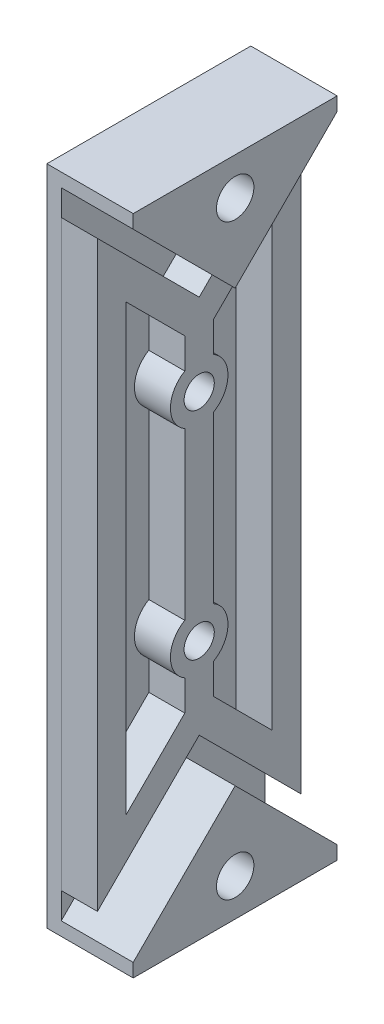
ISO-10303-21;
HEADER;
FILE_DESCRIPTION(('STEP AP214'),'2;1');
FILE_NAME('part.step','',(''),(''),'','','');
FILE_SCHEMA(('AUTOMOTIVE_DESIGN { 1 0 10303 214 1 1 1 1 }'));
ENDSEC;
DATA;
#1=APPLICATION_CONTEXT('core data for automotive mechanical design processes');
#2=APPLICATION_PROTOCOL_DEFINITION('international standard','automotive_design',2000,#1);
#3=PRODUCT_CONTEXT('',#1,'mechanical');
#4=PRODUCT('Part','Part','',(#3));
#5=PRODUCT_RELATED_PRODUCT_CATEGORY('part','',(#4));
#6=PRODUCT_DEFINITION_FORMATION('','',#4);
#7=PRODUCT_DEFINITION_CONTEXT('part definition',#1,'design');
#8=PRODUCT_DEFINITION('design','',#6,#7);
#9=PRODUCT_DEFINITION_SHAPE('','',#8);
#10=(LENGTH_UNIT() NAMED_UNIT(*) SI_UNIT(.MILLI.,.METRE.));
#11=(NAMED_UNIT(*) PLANE_ANGLE_UNIT() SI_UNIT($,.RADIAN.));
#12=(NAMED_UNIT(*) SI_UNIT($,.STERADIAN.) SOLID_ANGLE_UNIT());
#13=UNCERTAINTY_MEASURE_WITH_UNIT(LENGTH_MEASURE(1.E-05),#10,'distance_accuracy_value','');
#14=(GEOMETRIC_REPRESENTATION_CONTEXT(3) GLOBAL_UNCERTAINTY_ASSIGNED_CONTEXT((#13)) GLOBAL_UNIT_ASSIGNED_CONTEXT((#10,
#11,#12)) REPRESENTATION_CONTEXT('',''));
#15=CARTESIAN_POINT('',(0.,0.,0.));
#16=DIRECTION('',(0.,0.,1.));
#17=DIRECTION('',(1.,0.,0.));
#18=AXIS2_PLACEMENT_3D('',#15,#16,#17);
#19=CARTESIAN_POINT('',(0.,0.,-12.142135623731));
#20=DIRECTION('',(0.,0.,-1.));
#21=DIRECTION('',(-1.,0.,0.));
#22=AXIS2_PLACEMENT_3D('',#19,#20,#21);
#23=PLANE('',#22);
#24=DIRECTION('',(0.,1.,0.));
#25=VECTOR('',#24,1.);
#26=CARTESIAN_POINT('',(0.,0.,-12.142135623731));
#27=LINE('',#26,#25);
#28=CARTESIAN_POINT('',(0.,-22.0358983848622,-12.142135623731));
#29=VERTEX_POINT('',#28);
#30=CARTESIAN_POINT('',(0.,-17.7989898732233,-12.142135623731));
#31=VERTEX_POINT('',#30);
#32=EDGE_CURVE('E434',#29,#31,#27,.T.);
#33=ORIENTED_EDGE('',*,*,#32,.F.);
#34=DIRECTION('',(1.,0.,0.));
#35=VECTOR('',#34,1.);
#36=CARTESIAN_POINT('',(-2.,-22.0358983848622,-12.142135623731));
#37=LINE('',#36,#35);
#38=CARTESIAN_POINT('',(5.,-22.0358983848622,-12.142135623731));
#39=VERTEX_POINT('',#38);
#40=EDGE_CURVE('E59',#29,#39,#37,.T.);
#41=ORIENTED_EDGE('',*,*,#40,.T.);
#42=DIRECTION('',(0.,1.,0.));
#43=VECTOR('',#42,1.);
#44=CARTESIAN_POINT('',(5.,0.,-12.142135623731));
#45=LINE('',#44,#43);
#46=CARTESIAN_POINT('',(5.,-17.7989898732233,-12.142135623731));
#47=VERTEX_POINT('',#46);
#48=EDGE_CURVE('E421',#39,#47,#45,.T.);
#49=ORIENTED_EDGE('',*,*,#48,.T.);
#50=DIRECTION('',(1.,0.,0.));
#51=VECTOR('',#50,1.);
#52=CARTESIAN_POINT('',(0.,-17.7989898732233,-12.142135623731));
#53=LINE('',#52,#51);
#54=EDGE_CURVE('E443',#31,#47,#53,.T.);
#55=ORIENTED_EDGE('',*,*,#54,.F.);
#56=EDGE_LOOP('',(#33,#41,#49,#55));
#57=FACE_BOUND('',#56,.T.);
#58=ADVANCED_FACE('F36',(#57),#23,.F.);
#59=CARTESIAN_POINT('',(0.,0.,-16.142135623731));
#60=DIRECTION('',(0.,0.,-1.));
#61=DIRECTION('',(-1.,0.,0.));
#62=AXIS2_PLACEMENT_3D('',#59,#60,#61);
#63=PLANE('',#62);
#64=DIRECTION('',(1.,0.,0.));
#65=VECTOR('',#64,1.);
#66=CARTESIAN_POINT('',(-2.,-22.0358983848622,-16.142135623731));
#67=LINE('',#66,#65);
#68=CARTESIAN_POINT('',(0.,-22.0358983848622,-16.142135623731));
#69=VERTEX_POINT('',#68);
#70=CARTESIAN_POINT('',(5.,-22.0358983848622,-16.142135623731));
#71=VERTEX_POINT('',#70);
#72=EDGE_CURVE('E325',#69,#71,#67,.T.);
#73=ORIENTED_EDGE('',*,*,#72,.F.);
#74=DIRECTION('',(0.,1.,0.));
#75=VECTOR('',#74,1.);
#76=CARTESIAN_POINT('',(0.,0.,-16.142135623731));
#77=LINE('',#76,#75);
#78=CARTESIAN_POINT('',(0.,-17.7989898732233,-16.142135623731));
#79=VERTEX_POINT('',#78);
#80=EDGE_CURVE('E399',#69,#79,#77,.T.);
#81=ORIENTED_EDGE('',*,*,#80,.T.);
#82=DIRECTION('',(1.,0.,0.));
#83=VECTOR('',#82,1.);
#84=CARTESIAN_POINT('',(0.,-17.7989898732233,-16.142135623731));
#85=LINE('',#84,#83);
#86=CARTESIAN_POINT('',(5.,-17.7989898732233,-16.142135623731));
#87=VERTEX_POINT('',#86);
#88=EDGE_CURVE('E424',#79,#87,#85,.T.);
#89=ORIENTED_EDGE('',*,*,#88,.T.);
#90=DIRECTION('',(0.,1.,0.));
#91=VECTOR('',#90,1.);
#92=CARTESIAN_POINT('',(5.,0.,-16.142135623731));
#93=LINE('',#92,#91);
#94=EDGE_CURVE('E412',#71,#87,#93,.T.);
#95=ORIENTED_EDGE('',*,*,#94,.F.);
#96=EDGE_LOOP('',(#73,#81,#89,#95));
#97=FACE_BOUND('',#96,.T.);
#98=ADVANCED_FACE('F543',(#97),#63,.T.);
#99=CARTESIAN_POINT('',(5.,-52.0358983848622,-12.142135623731));
#100=VERTEX_POINT('',#99);
#101=CARTESIAN_POINT('',(5.,-28.9641016151377,-12.142135623731));
#102=VERTEX_POINT('',#101);
#103=EDGE_CURVE('E448',#100,#102,#45,.T.);
#104=ORIENTED_EDGE('',*,*,#103,.T.);
#105=DIRECTION('',(1.,0.,0.));
#106=VECTOR('',#105,1.);
#107=CARTESIAN_POINT('',(-2.,-28.9641016151377,-12.142135623731));
#108=LINE('',#107,#106);
#109=CARTESIAN_POINT('',(0.,-28.9641016151377,-12.142135623731));
#110=VERTEX_POINT('',#109);
#111=EDGE_CURVE('E318',#102,#110,#108,.F.);
#112=ORIENTED_EDGE('',*,*,#111,.T.);
#113=CARTESIAN_POINT('',(0.,-52.0358983848622,-12.142135623731));
#114=VERTEX_POINT('',#113);
#115=EDGE_CURVE('E433',#114,#110,#27,.T.);
#116=ORIENTED_EDGE('',*,*,#115,.F.);
#117=DIRECTION('',(1.,0.,0.));
#118=VECTOR('',#117,1.);
#119=CARTESIAN_POINT('',(-2.,-52.0358983848622,-12.142135623731));
#120=LINE('',#119,#118);
#121=EDGE_CURVE('E337',#114,#100,#120,.T.);
#122=ORIENTED_EDGE('',*,*,#121,.T.);
#123=EDGE_LOOP('',(#104,#112,#116,#122));
#124=FACE_BOUND('',#123,.T.);
#125=ADVANCED_FACE('F546',(#124),#23,.F.);
#126=DIRECTION('',(1.,0.,0.));
#127=VECTOR('',#126,1.);
#128=CARTESIAN_POINT('',(-2.,-28.9641016151377,-16.142135623731));
#129=LINE('',#128,#127);
#130=CARTESIAN_POINT('',(5.,-28.9641016151377,-16.142135623731));
#131=VERTEX_POINT('',#130);
#132=CARTESIAN_POINT('',(0.,-28.9641016151377,-16.142135623731));
#133=VERTEX_POINT('',#132);
#134=EDGE_CURVE('E51',#131,#133,#129,.F.);
#135=ORIENTED_EDGE('',*,*,#134,.F.);
#136=CARTESIAN_POINT('',(5.,-52.0358983848622,-16.142135623731));
#137=VERTEX_POINT('',#136);
#138=EDGE_CURVE('E416',#137,#131,#93,.T.);
#139=ORIENTED_EDGE('',*,*,#138,.F.);
#140=DIRECTION('',(1.,0.,0.));
#141=VECTOR('',#140,1.);
#142=CARTESIAN_POINT('',(-2.,-52.0358983848622,-16.142135623731));
#143=LINE('',#142,#141);
#144=CARTESIAN_POINT('',(0.,-52.0358983848622,-16.142135623731));
#145=VERTEX_POINT('',#144);
#146=EDGE_CURVE('E345',#145,#137,#143,.T.);
#147=ORIENTED_EDGE('',*,*,#146,.F.);
#148=EDGE_CURVE('E404',#145,#133,#77,.T.);
#149=ORIENTED_EDGE('',*,*,#148,.T.);
#150=EDGE_LOOP('',(#135,#139,#147,#149));
#151=FACE_BOUND('',#150,.T.);
#152=ADVANCED_FACE('F553',(#151),#63,.T.);
#153=CARTESIAN_POINT('',(0.,0.,0.));
#154=DIRECTION('',(-1.,0.,0.));
#155=DIRECTION('',(0.,0.,1.));
#156=AXIS2_PLACEMENT_3D('',#153,#154,#155);
#157=PLANE('',#156);
#158=DIRECTION('',(0.,0.707106781186546,-0.707106781186549));
#159=VECTOR('',#158,1.);
#160=CARTESIAN_POINT('',(0.,-40.5000000000001,-40.5));
#161=LINE('',#160,#159);
#162=CARTESIAN_POINT('',(0.,-81.,0.));
#163=VERTEX_POINT('',#162);
#164=CARTESIAN_POINT('',(0.,-66.8578643762691,-14.142135623731));
#165=VERTEX_POINT('',#164);
#166=EDGE_CURVE('E486',#163,#165,#161,.T.);
#167=ORIENTED_EDGE('',*,*,#166,.F.);
#168=DIRECTION('',(0.,-1.,0.));
#169=VECTOR('',#168,1.);
#170=CARTESIAN_POINT('',(0.,0.,0.));
#171=LINE('',#170,#169);
#172=CARTESIAN_POINT('',(0.,0.,0.));
#173=VERTEX_POINT('',#172);
#174=EDGE_CURVE('E459',#173,#163,#171,.T.);
#175=ORIENTED_EDGE('',*,*,#174,.F.);
#176=DIRECTION('',(0.,-0.707106781186546,-0.707106781186549));
#177=VECTOR('',#176,1.);
#178=CARTESIAN_POINT('',(0.,0.,0.));
#179=LINE('',#178,#177);
#180=CARTESIAN_POINT('',(0.,-14.1421356237309,-14.142135623731));
#181=VERTEX_POINT('',#180);
#182=EDGE_CURVE('E470',#173,#181,#179,.T.);
#183=ORIENTED_EDGE('',*,*,#182,.T.);
#184=DIRECTION('',(0.,0.707106781186546,-0.707106781186549));
#185=VECTOR('',#184,1.);
#186=CARTESIAN_POINT('',(0.,-14.142135623731,-14.1421356237309));
#187=LINE('',#186,#185);
#188=CARTESIAN_POINT('',(0.,0.,-28.2842712474619));
#189=VERTEX_POINT('',#188);
#190=EDGE_CURVE('E494',#181,#189,#187,.T.);
#191=ORIENTED_EDGE('',*,*,#190,.T.);
#192=DIRECTION('',(0.,-1.,0.));
#193=VECTOR('',#192,1.);
#194=CARTESIAN_POINT('',(0.,0.,-28.2842712474619));
#195=LINE('',#194,#193);
#196=CARTESIAN_POINT('',(0.,-81.,-28.2842712474619));
#197=VERTEX_POINT('',#196);
#198=EDGE_CURVE('E491',#189,#197,#195,.T.);
#199=ORIENTED_EDGE('',*,*,#198,.T.);
#200=DIRECTION('',(0.,-0.707106781186546,-0.707106781186549));
#201=VECTOR('',#200,1.);
#202=CARTESIAN_POINT('',(0.,-26.3578643762692,26.3578643762691));
#203=LINE('',#202,#201);
#204=EDGE_CURVE('E488',#165,#197,#203,.T.);
#205=ORIENTED_EDGE('',*,*,#204,.F.);
#206=EDGE_LOOP('',(#167,#175,#183,#191,#199,#205));
#207=FACE_BOUND('',#206,.T.);
#208=DIRECTION('',(0.,-0.707106781186545,-0.70710678118655));
#209=VECTOR('',#208,1.);
#210=CARTESIAN_POINT('',(0.,-28.1539156004832,28.153915600483));
#211=LINE('',#210,#209);
#212=CARTESIAN_POINT('',(0.,-70.4499668246967,-14.1421356237309));
#213=VERTEX_POINT('',#212);
#214=CARTESIAN_POINT('',(0.,-84.6199668246967,-28.312135623731));
#215=VERTEX_POINT('',#214);
#216=EDGE_CURVE('E353',#213,#215,#211,.T.);
#217=ORIENTED_EDGE('',*,*,#216,.T.);
#218=DIRECTION('',(0.,-1.,0.));
#219=VECTOR('',#218,1.);
#220=CARTESIAN_POINT('',(0.,5.50000000000001,-28.312135623731));
#221=LINE('',#220,#219);
#222=CARTESIAN_POINT('',(0.,3.61996682469674,-28.312135623731));
#223=VERTEX_POINT('',#222);
#224=EDGE_CURVE('E373',#223,#215,#221,.T.);
#225=ORIENTED_EDGE('',*,*,#224,.F.);
#226=DIRECTION('',(0.,0.707106781186548,-0.707106781186547));
#227=VECTOR('',#226,1.);
#228=CARTESIAN_POINT('',(0.,-12.3460843995171,-12.3460843995171));
#229=LINE('',#228,#227);
#230=CARTESIAN_POINT('',(0.,-10.5500331753033,-14.1421356237309));
#231=VERTEX_POINT('',#230);
#232=EDGE_CURVE('E361',#231,#223,#229,.T.);
#233=ORIENTED_EDGE('',*,*,#232,.F.);
#234=DIRECTION('',(0.,0.707106781186552,0.707106781186543));
#235=VECTOR('',#234,1.);
#236=CARTESIAN_POINT('',(0.,1.79605122421382,-1.79605122421384));
#237=LINE('',#236,#235);
#238=CARTESIAN_POINT('',(0.,3.61996682469671,0.0278643762690201));
#239=VERTEX_POINT('',#238);
#240=EDGE_CURVE('E367',#231,#239,#237,.T.);
#241=ORIENTED_EDGE('',*,*,#240,.T.);
#242=DIRECTION('',(0.,1.,0.));
#243=VECTOR('',#242,1.);
#244=CARTESIAN_POINT('',(0.,5.50000000000001,0.0278643762690089));
#245=LINE('',#244,#243);
#246=CARTESIAN_POINT('',(0.,-84.6199668246967,0.0278643762690199));
#247=VERTEX_POINT('',#246);
#248=EDGE_CURVE('E379',#247,#239,#245,.T.);
#249=ORIENTED_EDGE('',*,*,#248,.F.);
#250=DIRECTION('',(0.,0.707106781186547,-0.707106781186548));
#251=VECTOR('',#250,1.);
#252=CARTESIAN_POINT('',(0.,-42.2960512242138,-42.2960512242138));
#253=LINE('',#252,#251);
#254=EDGE_CURVE('E356',#247,#213,#253,.T.);
#255=ORIENTED_EDGE('',*,*,#254,.T.);
#256=EDGE_LOOP('',(#217,#225,#233,#241,#249,#255));
#257=FACE_BOUND('',#256,.T.);
#258=ADVANCED_FACE('F516',(#207,#257),#157,.F.);
#259=CARTESIAN_POINT('',(5.,0.,0.));
#260=DIRECTION('',(0.,0.,-1.));
#261=DIRECTION('',(0.,1.,0.));
#262=AXIS2_PLACEMENT_3D('',#259,#260,#261);
#263=PLANE('',#262);
#264=ORIENTED_EDGE('',*,*,#174,.T.);
#265=DIRECTION('',(-1.,0.,0.));
#266=VECTOR('',#265,1.);
#267=CARTESIAN_POINT('',(5.,-81.,0.));
#268=LINE('',#267,#266);
#269=CARTESIAN_POINT('',(5.,-81.,0.));
#270=VERTEX_POINT('',#269);
#271=EDGE_CURVE('E11',#270,#163,#268,.T.);
#272=ORIENTED_EDGE('',*,*,#271,.F.);
#273=DIRECTION('',(0.,-1.,0.));
#274=VECTOR('',#273,1.);
#275=CARTESIAN_POINT('',(5.,0.,0.));
#276=LINE('',#275,#274);
#277=CARTESIAN_POINT('',(5.,0.,0.));
#278=VERTEX_POINT('',#277);
#279=EDGE_CURVE('E466',#278,#270,#276,.T.);
#280=ORIENTED_EDGE('',*,*,#279,.F.);
#281=DIRECTION('',(-1.,0.,0.));
#282=VECTOR('',#281,1.);
#283=CARTESIAN_POINT('',(5.,0.,0.));
#284=LINE('',#283,#282);
#285=EDGE_CURVE('E483',#278,#173,#284,.T.);
#286=ORIENTED_EDGE('',*,*,#285,.T.);
#287=EDGE_LOOP('',(#264,#272,#280,#286));
#288=FACE_BOUND('',#287,.T.);
#289=ADVANCED_FACE('F38',(#288),#263,.F.);
#290=CARTESIAN_POINT('',(5.,-40.5000000000001,-40.5));
#291=DIRECTION('',(0.,0.707106781186549,0.707106781186546));
#292=DIRECTION('',(0.,-0.707106781186546,0.707106781186549));
#293=AXIS2_PLACEMENT_3D('',#290,#291,#292);
#294=PLANE('',#293);
#295=ORIENTED_EDGE('',*,*,#166,.T.);
#296=DIRECTION('',(-1.,0.,0.));
#297=VECTOR('',#296,1.);
#298=CARTESIAN_POINT('',(5.,-66.8578643762691,-14.142135623731));
#299=LINE('',#298,#297);
#300=CARTESIAN_POINT('',(5.,-66.8578643762691,-14.142135623731));
#301=VERTEX_POINT('',#300);
#302=EDGE_CURVE('E44',#301,#165,#299,.T.);
#303=ORIENTED_EDGE('',*,*,#302,.F.);
#304=DIRECTION('',(0.,0.707106781186546,-0.707106781186549));
#305=VECTOR('',#304,1.);
#306=CARTESIAN_POINT('',(5.,-40.5000000000001,-40.5));
#307=LINE('',#306,#305);
#308=EDGE_CURVE('E469',#270,#301,#307,.T.);
#309=ORIENTED_EDGE('',*,*,#308,.F.);
#310=ORIENTED_EDGE('',*,*,#271,.T.);
#311=EDGE_LOOP('',(#295,#303,#309,#310));
#312=FACE_BOUND('',#311,.T.);
#313=ADVANCED_FACE('F535',(#312),#294,.F.);
#314=CARTESIAN_POINT('',(5.,-26.3578643762692,26.3578643762691));
#315=DIRECTION('',(0.,0.707106781186549,-0.707106781186546));
#316=DIRECTION('',(0.,0.707106781186546,0.707106781186549));
#317=AXIS2_PLACEMENT_3D('',#314,#315,#316);
#318=PLANE('',#317);
#319=ORIENTED_EDGE('',*,*,#204,.T.);
#320=DIRECTION('',(-1.,0.,0.));
#321=VECTOR('',#320,1.);
#322=CARTESIAN_POINT('',(5.,-81.,-28.2842712474619));
#323=LINE('',#322,#321);
#324=CARTESIAN_POINT('',(5.,-81.,-28.2842712474619));
#325=VERTEX_POINT('',#324);
#326=EDGE_CURVE('E505',#325,#197,#323,.T.);
#327=ORIENTED_EDGE('',*,*,#326,.F.);
#328=DIRECTION('',(0.,-0.707106781186546,-0.707106781186549));
#329=VECTOR('',#328,1.);
#330=CARTESIAN_POINT('',(5.,-26.3578643762692,26.3578643762691));
#331=LINE('',#330,#329);
#332=EDGE_CURVE('E472',#301,#325,#331,.T.);
#333=ORIENTED_EDGE('',*,*,#332,.F.);
#334=ORIENTED_EDGE('',*,*,#302,.T.);
#335=EDGE_LOOP('',(#319,#327,#333,#334));
#336=FACE_BOUND('',#335,.T.);
#337=ADVANCED_FACE('F511',(#336),#318,.F.);
#338=CARTESIAN_POINT('',(5.,0.,-28.2842712474619));
#339=DIRECTION('',(0.,0.,-1.));
#340=DIRECTION('',(0.,1.,0.));
#341=AXIS2_PLACEMENT_3D('',#338,#339,#340);
#342=PLANE('',#341);
#343=ORIENTED_EDGE('',*,*,#198,.F.);
#344=DIRECTION('',(-1.,0.,0.));
#345=VECTOR('',#344,1.);
#346=CARTESIAN_POINT('',(5.,0.,-28.2842712474619));
#347=LINE('',#346,#345);
#348=CARTESIAN_POINT('',(5.,0.,-28.2842712474619));
#349=VERTEX_POINT('',#348);
#350=EDGE_CURVE('E503',#349,#189,#347,.T.);
#351=ORIENTED_EDGE('',*,*,#350,.F.);
#352=DIRECTION('',(0.,-1.,0.));
#353=VECTOR('',#352,1.);
#354=CARTESIAN_POINT('',(5.,0.,-28.2842712474619));
#355=LINE('',#354,#353);
#356=EDGE_CURVE('E474',#349,#325,#355,.T.);
#357=ORIENTED_EDGE('',*,*,#356,.T.);
#358=ORIENTED_EDGE('',*,*,#326,.T.);
#359=EDGE_LOOP('',(#343,#351,#357,#358));
#360=FACE_BOUND('',#359,.T.);
#361=ADVANCED_FACE('F521',(#360),#342,.T.);
#362=CARTESIAN_POINT('',(5.,-14.142135623731,-14.1421356237309));
#363=DIRECTION('',(0.,0.707106781186549,0.707106781186546));
#364=DIRECTION('',(0.,-0.707106781186546,0.707106781186549));
#365=AXIS2_PLACEMENT_3D('',#362,#363,#364);
#366=PLANE('',#365);
#367=ORIENTED_EDGE('',*,*,#190,.F.);
#368=DIRECTION('',(-1.,0.,0.));
#369=VECTOR('',#368,1.);
#370=CARTESIAN_POINT('',(5.,-14.1421356237309,-14.142135623731));
#371=LINE('',#370,#369);
#372=CARTESIAN_POINT('',(5.,-14.1421356237309,-14.142135623731));
#373=VERTEX_POINT('',#372);
#374=EDGE_CURVE('E500',#373,#181,#371,.T.);
#375=ORIENTED_EDGE('',*,*,#374,.F.);
#376=DIRECTION('',(0.,0.707106781186546,-0.707106781186549));
#377=VECTOR('',#376,1.);
#378=CARTESIAN_POINT('',(5.,-14.142135623731,-14.1421356237309));
#379=LINE('',#378,#377);
#380=EDGE_CURVE('E477',#373,#349,#379,.T.);
#381=ORIENTED_EDGE('',*,*,#380,.T.);
#382=ORIENTED_EDGE('',*,*,#350,.T.);
#383=EDGE_LOOP('',(#367,#375,#381,#382));
#384=FACE_BOUND('',#383,.T.);
#385=ADVANCED_FACE('F528',(#384),#366,.T.);
#386=CARTESIAN_POINT('',(5.,0.,0.));
#387=DIRECTION('',(0.,0.707106781186549,-0.707106781186546));
#388=DIRECTION('',(0.,0.707106781186546,0.707106781186549));
#389=AXIS2_PLACEMENT_3D('',#386,#387,#388);
#390=PLANE('',#389);
#391=ORIENTED_EDGE('',*,*,#182,.F.);
#392=ORIENTED_EDGE('',*,*,#285,.F.);
#393=DIRECTION('',(0.,-0.707106781186546,-0.707106781186549));
#394=VECTOR('',#393,1.);
#395=CARTESIAN_POINT('',(5.,0.,0.));
#396=LINE('',#395,#394);
#397=EDGE_CURVE('E480',#278,#373,#396,.T.);
#398=ORIENTED_EDGE('',*,*,#397,.T.);
#399=ORIENTED_EDGE('',*,*,#374,.T.);
#400=EDGE_LOOP('',(#391,#392,#398,#399));
#401=FACE_BOUND('',#400,.T.);
#402=ADVANCED_FACE('F531',(#401),#390,.T.);
#403=CARTESIAN_POINT('',(5.,0.,0.));
#404=DIRECTION('',(1.,0.,0.));
#405=DIRECTION('',(0.,0.,-1.));
#406=AXIS2_PLACEMENT_3D('',#403,#404,#405);
#407=PLANE('',#406);
#408=CARTESIAN_POINT('',(5.,-55.5,-14.142135623731));
#409=DIRECTION('',(1.,0.,0.));
#410=DIRECTION('',(0.,0.,-1.));
#411=AXIS2_PLACEMENT_3D('',#408,#409,#410);
#412=CIRCLE('',#411,2.1);
#413=CARTESIAN_POINT('',(5.,-55.5,-16.242135623731));
#414=VERTEX_POINT('',#413);
#415=EDGE_CURVE('E300',#414,#414,#412,.T.);
#416=ORIENTED_EDGE('',*,*,#415,.F.);
#417=EDGE_LOOP('',(#416));
#418=FACE_BOUND('',#417,.T.);
#419=CARTESIAN_POINT('',(5.,-25.5,-14.142135623731));
#420=DIRECTION('',(1.,0.,0.));
#421=DIRECTION('',(0.,0.,-1.));
#422=AXIS2_PLACEMENT_3D('',#419,#420,#421);
#423=CIRCLE('',#422,2.1);
#424=CARTESIAN_POINT('',(5.,-25.5,-16.242135623731));
#425=VERTEX_POINT('',#424);
#426=EDGE_CURVE('E304',#425,#425,#423,.T.);
#427=ORIENTED_EDGE('',*,*,#426,.F.);
#428=EDGE_LOOP('',(#427));
#429=FACE_BOUND('',#428,.T.);
#430=ORIENTED_EDGE('',*,*,#48,.F.);
#431=CARTESIAN_POINT('',(5.,-25.5,-14.142135623731));
#432=DIRECTION('',(1.,0.,0.));
#433=DIRECTION('',(0.,0.,-1.));
#434=AXIS2_PLACEMENT_3D('',#431,#432,#433);
#435=CIRCLE('',#434,4.);
#436=EDGE_CURVE('E315',#39,#102,#435,.T.);
#437=ORIENTED_EDGE('',*,*,#436,.T.);
#438=ORIENTED_EDGE('',*,*,#103,.F.);
#439=CARTESIAN_POINT('',(5.,-55.5,-14.142135623731));
#440=DIRECTION('',(1.,0.,0.));
#441=DIRECTION('',(0.,0.,-1.));
#442=AXIS2_PLACEMENT_3D('',#439,#440,#441);
#443=CIRCLE('',#442,4.);
#444=CARTESIAN_POINT('',(5.,-58.9641016151377,-12.142135623731));
#445=VERTEX_POINT('',#444);
#446=EDGE_CURVE('E330',#100,#445,#443,.T.);
#447=ORIENTED_EDGE('',*,*,#446,.T.);
#448=CARTESIAN_POINT('',(5.,-63.2010101267767,-12.142135623731));
#449=VERTEX_POINT('',#448);
#450=EDGE_CURVE('E444',#449,#445,#45,.T.);
#451=ORIENTED_EDGE('',*,*,#450,.F.);
#452=DIRECTION('',(0.,0.707106781186547,-0.707106781186548));
#453=VECTOR('',#452,1.);
#454=CARTESIAN_POINT('',(5.,-37.6715728752539,-37.6715728752538));
#455=LINE('',#454,#453);
#456=CARTESIAN_POINT('',(5.,-71.3431457505077,-4.));
#457=VERTEX_POINT('',#456);
#458=EDGE_CURVE('E454',#457,#449,#455,.T.);
#459=ORIENTED_EDGE('',*,*,#458,.F.);
#460=DIRECTION('',(0.,-1.,0.));
#461=VECTOR('',#460,1.);
#462=CARTESIAN_POINT('',(5.,0.,-4.));
#463=LINE('',#462,#461);
#464=CARTESIAN_POINT('',(5.,-9.65685424949236,-4.));
#465=VERTEX_POINT('',#464);
#466=EDGE_CURVE('E451',#465,#457,#463,.T.);
#467=ORIENTED_EDGE('',*,*,#466,.F.);
#468=DIRECTION('',(0.,0.707106781186546,0.707106781186549));
#469=VECTOR('',#468,1.);
#470=CARTESIAN_POINT('',(5.,-2.82842712474619,2.82842712474618));
#471=LINE('',#470,#469);
#472=EDGE_CURVE('E447',#47,#465,#471,.T.);
#473=ORIENTED_EDGE('',*,*,#472,.F.);
#474=EDGE_LOOP('',(#430,#437,#438,#447,#451,#459,#467,#473));
#475=FACE_BOUND('',#474,.T.);
#476=ORIENTED_EDGE('',*,*,#138,.T.);
#477=EDGE_CURVE('E310',#131,#71,#435,.T.);
#478=ORIENTED_EDGE('',*,*,#477,.T.);
#479=ORIENTED_EDGE('',*,*,#94,.T.);
#480=DIRECTION('',(0.,-0.707106781186546,0.707106781186549));
#481=VECTOR('',#480,1.);
#482=CARTESIAN_POINT('',(5.,-16.9705627484772,-16.9705627484771));
#483=LINE('',#482,#481);
#484=CARTESIAN_POINT('',(5.,-9.65685424949236,-24.2842712474619));
#485=VERTEX_POINT('',#484);
#486=EDGE_CURVE('E409',#485,#87,#483,.T.);
#487=ORIENTED_EDGE('',*,*,#486,.F.);
#488=DIRECTION('',(0.,1.,0.));
#489=VECTOR('',#488,1.);
#490=CARTESIAN_POINT('',(5.,0.,-24.2842712474619));
#491=LINE('',#490,#489);
#492=CARTESIAN_POINT('',(5.,-71.3431457505076,-24.2842712474619));
#493=VERTEX_POINT('',#492);
#494=EDGE_CURVE('E254',#493,#485,#491,.T.);
#495=ORIENTED_EDGE('',*,*,#494,.F.);
#496=DIRECTION('',(0.,-0.707106781186546,-0.707106781186549));
#497=VECTOR('',#496,1.);
#498=CARTESIAN_POINT('',(5.,-23.529437251523,23.5294372515229));
#499=LINE('',#498,#497);
#500=CARTESIAN_POINT('',(5.,-63.2010101267767,-16.142135623731));
#501=VERTEX_POINT('',#500);
#502=EDGE_CURVE('E396',#501,#493,#499,.T.);
#503=ORIENTED_EDGE('',*,*,#502,.F.);
#504=CARTESIAN_POINT('',(5.,-58.9641016151377,-16.142135623731));
#505=VERTEX_POINT('',#504);
#506=EDGE_CURVE('E413',#501,#505,#93,.T.);
#507=ORIENTED_EDGE('',*,*,#506,.T.);
#508=EDGE_CURVE('E327',#505,#137,#443,.T.);
#509=ORIENTED_EDGE('',*,*,#508,.T.);
#510=EDGE_LOOP('',(#476,#478,#479,#487,#495,#503,#507,#509));
#511=FACE_BOUND('',#510,.T.);
#512=ORIENTED_EDGE('',*,*,#279,.T.);
#513=ORIENTED_EDGE('',*,*,#308,.T.);
#514=ORIENTED_EDGE('',*,*,#332,.T.);
#515=ORIENTED_EDGE('',*,*,#356,.F.);
#516=ORIENTED_EDGE('',*,*,#380,.F.);
#517=ORIENTED_EDGE('',*,*,#397,.F.);
#518=EDGE_LOOP('',(#512,#513,#514,#515,#516,#517));
#519=FACE_BOUND('',#518,.T.);
#520=ADVANCED_FACE('F525',(#418,#429,#475,#511,#519),#407,.T.);
#521=ORIENTED_EDGE('',*,*,#450,.T.);
#522=DIRECTION('',(1.,0.,0.));
#523=VECTOR('',#522,1.);
#524=CARTESIAN_POINT('',(-2.,-58.9641016151377,-12.142135623731));
#525=LINE('',#524,#523);
#526=CARTESIAN_POINT('',(0.,-58.9641016151377,-12.142135623731));
#527=VERTEX_POINT('',#526);
#528=EDGE_CURVE('E334',#445,#527,#525,.F.);
#529=ORIENTED_EDGE('',*,*,#528,.T.);
#530=CARTESIAN_POINT('',(0.,-63.2010101267767,-12.142135623731));
#531=VERTEX_POINT('',#530);
#532=EDGE_CURVE('E429',#531,#527,#27,.T.);
#533=ORIENTED_EDGE('',*,*,#532,.F.);
#534=DIRECTION('',(1.,0.,0.));
#535=VECTOR('',#534,1.);
#536=CARTESIAN_POINT('',(0.,-63.2010101267767,-12.142135623731));
#537=LINE('',#536,#535);
#538=EDGE_CURVE('E457',#531,#449,#537,.T.);
#539=ORIENTED_EDGE('',*,*,#538,.T.);
#540=EDGE_LOOP('',(#521,#529,#533,#539));
#541=FACE_BOUND('',#540,.T.);
#542=ADVANCED_FACE('F547',(#541),#23,.F.);
#543=CARTESIAN_POINT('',(0.,-37.6715728752539,-37.6715728752538));
#544=DIRECTION('',(0.,-0.707106781186548,-0.707106781186547));
#545=DIRECTION('',(0.,0.707106781186547,-0.707106781186548));
#546=AXIS2_PLACEMENT_3D('',#543,#544,#545);
#547=PLANE('',#546);
#548=ORIENTED_EDGE('',*,*,#458,.T.);
#549=ORIENTED_EDGE('',*,*,#538,.F.);
#550=DIRECTION('',(0.,0.707106781186547,-0.707106781186548));
#551=VECTOR('',#550,1.);
#552=CARTESIAN_POINT('',(0.,-37.6715728752539,-37.6715728752538));
#553=LINE('',#552,#551);
#554=CARTESIAN_POINT('',(0.,-71.3431457505077,-4.));
#555=VERTEX_POINT('',#554);
#556=EDGE_CURVE('E440',#555,#531,#553,.T.);
#557=ORIENTED_EDGE('',*,*,#556,.F.);
#558=DIRECTION('',(1.,0.,0.));
#559=VECTOR('',#558,1.);
#560=CARTESIAN_POINT('',(0.,-71.3431457505077,-4.));
#561=LINE('',#560,#559);
#562=EDGE_CURVE('E460',#555,#457,#561,.T.);
#563=ORIENTED_EDGE('',*,*,#562,.T.);
#564=EDGE_LOOP('',(#548,#549,#557,#563));
#565=FACE_BOUND('',#564,.T.);
#566=ADVANCED_FACE('F561',(#565),#547,.F.);
#567=CARTESIAN_POINT('',(0.,0.,-4.));
#568=DIRECTION('',(0.,0.,1.));
#569=DIRECTION('',(0.,-1.,0.));
#570=AXIS2_PLACEMENT_3D('',#567,#568,#569);
#571=PLANE('',#570);
#572=ORIENTED_EDGE('',*,*,#466,.T.);
#573=ORIENTED_EDGE('',*,*,#562,.F.);
#574=DIRECTION('',(0.,-1.,0.));
#575=VECTOR('',#574,1.);
#576=CARTESIAN_POINT('',(0.,0.,-4.));
#577=LINE('',#576,#575);
#578=CARTESIAN_POINT('',(0.,-9.65685424949236,-4.));
#579=VERTEX_POINT('',#578);
#580=EDGE_CURVE('E437',#579,#555,#577,.T.);
#581=ORIENTED_EDGE('',*,*,#580,.F.);
#582=DIRECTION('',(1.,0.,0.));
#583=VECTOR('',#582,1.);
#584=CARTESIAN_POINT('',(0.,-9.65685424949236,-4.));
#585=LINE('',#584,#583);
#586=EDGE_CURVE('E462',#579,#465,#585,.T.);
#587=ORIENTED_EDGE('',*,*,#586,.T.);
#588=EDGE_LOOP('',(#572,#573,#581,#587));
#589=FACE_BOUND('',#588,.T.);
#590=ADVANCED_FACE('F567',(#589),#571,.F.);
#591=CARTESIAN_POINT('',(0.,-2.82842712474619,2.82842712474618));
#592=DIRECTION('',(0.,0.707106781186549,-0.707106781186546));
#593=DIRECTION('',(0.,0.707106781186546,0.707106781186549));
#594=AXIS2_PLACEMENT_3D('',#591,#592,#593);
#595=PLANE('',#594);
#596=ORIENTED_EDGE('',*,*,#472,.T.);
#597=ORIENTED_EDGE('',*,*,#586,.F.);
#598=DIRECTION('',(0.,0.707106781186546,0.707106781186549));
#599=VECTOR('',#598,1.);
#600=CARTESIAN_POINT('',(0.,-2.82842712474619,2.82842712474618));
#601=LINE('',#600,#599);
#602=EDGE_CURVE('E432',#31,#579,#601,.T.);
#603=ORIENTED_EDGE('',*,*,#602,.F.);
#604=ORIENTED_EDGE('',*,*,#54,.T.);
#605=EDGE_LOOP('',(#596,#597,#603,#604));
#606=FACE_BOUND('',#605,.T.);
#607=ADVANCED_FACE('F592',(#606),#595,.F.);
#608=CARTESIAN_POINT('',(0.,0.,-24.2842712474619));
#609=DIRECTION('',(0.,0.,-1.));
#610=DIRECTION('',(0.,1.,0.));
#611=AXIS2_PLACEMENT_3D('',#608,#609,#610);
#612=PLANE('',#611);
#613=ORIENTED_EDGE('',*,*,#494,.T.);
#614=DIRECTION('',(1.,0.,0.));
#615=VECTOR('',#614,1.);
#616=CARTESIAN_POINT('',(0.,-9.65685424949236,-24.2842712474619));
#617=LINE('',#616,#615);
#618=CARTESIAN_POINT('',(0.,-9.65685424949236,-24.2842712474619));
#619=VERTEX_POINT('',#618);
#620=EDGE_CURVE('E407',#619,#485,#617,.T.);
#621=ORIENTED_EDGE('',*,*,#620,.F.);
#622=DIRECTION('',(0.,1.,0.));
#623=VECTOR('',#622,1.);
#624=CARTESIAN_POINT('',(0.,0.,-24.2842712474619));
#625=LINE('',#624,#623);
#626=CARTESIAN_POINT('',(0.,-71.3431457505076,-24.2842712474619));
#627=VERTEX_POINT('',#626);
#628=EDGE_CURVE('E392',#627,#619,#625,.T.);
#629=ORIENTED_EDGE('',*,*,#628,.F.);
#630=DIRECTION('',(1.,0.,0.));
#631=VECTOR('',#630,1.);
#632=CARTESIAN_POINT('',(0.,-71.3431457505076,-24.2842712474619));
#633=LINE('',#632,#631);
#634=EDGE_CURVE('E419',#627,#493,#633,.T.);
#635=ORIENTED_EDGE('',*,*,#634,.T.);
#636=EDGE_LOOP('',(#613,#621,#629,#635));
#637=FACE_BOUND('',#636,.T.);
#638=ADVANCED_FACE('F656',(#637),#612,.F.);
#639=CARTESIAN_POINT('',(0.,-23.529437251523,23.5294372515229));
#640=DIRECTION('',(0.,-0.707106781186549,0.707106781186546));
#641=DIRECTION('',(0.,-0.707106781186546,-0.707106781186549));
#642=AXIS2_PLACEMENT_3D('',#639,#640,#641);
#643=PLANE('',#642);
#644=ORIENTED_EDGE('',*,*,#502,.T.);
#645=ORIENTED_EDGE('',*,*,#634,.F.);
#646=DIRECTION('',(0.,-0.707106781186546,-0.707106781186549));
#647=VECTOR('',#646,1.);
#648=CARTESIAN_POINT('',(0.,-23.529437251523,23.5294372515229));
#649=LINE('',#648,#647);
#650=CARTESIAN_POINT('',(0.,-63.2010101267767,-16.142135623731));
#651=VERTEX_POINT('',#650);
#652=EDGE_CURVE('E403',#651,#627,#649,.T.);
#653=ORIENTED_EDGE('',*,*,#652,.F.);
#654=DIRECTION('',(1.,0.,0.));
#655=VECTOR('',#654,1.);
#656=CARTESIAN_POINT('',(0.,-63.2010101267767,-16.142135623731));
#657=LINE('',#656,#655);
#658=EDGE_CURVE('E422',#651,#501,#657,.T.);
#659=ORIENTED_EDGE('',*,*,#658,.T.);
#660=EDGE_LOOP('',(#644,#645,#653,#659));
#661=FACE_BOUND('',#660,.T.);
#662=ADVANCED_FACE('F654',(#661),#643,.F.);
#663=DIRECTION('',(1.,0.,0.));
#664=VECTOR('',#663,1.);
#665=CARTESIAN_POINT('',(-2.,-58.9641016151377,-16.142135623731));
#666=LINE('',#665,#664);
#667=CARTESIAN_POINT('',(0.,-58.9641016151377,-16.142135623731));
#668=VERTEX_POINT('',#667);
#669=EDGE_CURVE('E343',#505,#668,#666,.F.);
#670=ORIENTED_EDGE('',*,*,#669,.F.);
#671=ORIENTED_EDGE('',*,*,#506,.F.);
#672=ORIENTED_EDGE('',*,*,#658,.F.);
#673=EDGE_CURVE('E400',#651,#668,#77,.T.);
#674=ORIENTED_EDGE('',*,*,#673,.T.);
#675=EDGE_LOOP('',(#670,#671,#672,#674));
#676=FACE_BOUND('',#675,.T.);
#677=ADVANCED_FACE('F554',(#676),#63,.T.);
#678=CARTESIAN_POINT('',(0.,-16.9705627484772,-16.9705627484771));
#679=DIRECTION('',(0.,0.707106781186549,0.707106781186546));
#680=DIRECTION('',(0.,-0.707106781186546,0.707106781186549));
#681=AXIS2_PLACEMENT_3D('',#678,#679,#680);
#682=PLANE('',#681);
#683=ORIENTED_EDGE('',*,*,#486,.T.);
#684=ORIENTED_EDGE('',*,*,#88,.F.);
#685=DIRECTION('',(0.,-0.707106781186546,0.707106781186549));
#686=VECTOR('',#685,1.);
#687=CARTESIAN_POINT('',(0.,-16.9705627484772,-16.9705627484771));
#688=LINE('',#687,#686);
#689=EDGE_CURVE('E395',#619,#79,#688,.T.);
#690=ORIENTED_EDGE('',*,*,#689,.F.);
#691=ORIENTED_EDGE('',*,*,#620,.T.);
#692=EDGE_LOOP('',(#683,#684,#690,#691));
#693=FACE_BOUND('',#692,.T.);
#694=ADVANCED_FACE('F660',(#693),#682,.F.);
#695=ORIENTED_EDGE('',*,*,#80,.F.);
#696=CARTESIAN_POINT('',(0.,-25.5,-14.142135623731));
#697=DIRECTION('',(-1.,0.,0.));
#698=DIRECTION('',(0.,0.,1.));
#699=AXIS2_PLACEMENT_3D('',#696,#697,#698);
#700=CIRCLE('',#699,4.);
#701=EDGE_CURVE('E322',#69,#133,#700,.T.);
#702=ORIENTED_EDGE('',*,*,#701,.T.);
#703=ORIENTED_EDGE('',*,*,#148,.F.);
#704=CARTESIAN_POINT('',(0.,-55.5,-14.142135623731));
#705=DIRECTION('',(-1.,0.,0.));
#706=DIRECTION('',(0.,0.,1.));
#707=AXIS2_PLACEMENT_3D('',#704,#705,#706);
#708=CIRCLE('',#707,4.);
#709=EDGE_CURVE('E340',#145,#668,#708,.T.);
#710=ORIENTED_EDGE('',*,*,#709,.T.);
#711=ORIENTED_EDGE('',*,*,#673,.F.);
#712=ORIENTED_EDGE('',*,*,#652,.T.);
#713=ORIENTED_EDGE('',*,*,#628,.T.);
#714=ORIENTED_EDGE('',*,*,#689,.T.);
#715=EDGE_LOOP('',(#695,#702,#703,#710,#711,#712,#713,#714));
#716=FACE_BOUND('',#715,.T.);
#717=ADVANCED_FACE('F642',(#716),#157,.F.);
#718=ORIENTED_EDGE('',*,*,#115,.T.);
#719=CARTESIAN_POINT('',(0.,-25.5,-14.142135623731));
#720=DIRECTION('',(-1.,0.,0.));
#721=DIRECTION('',(0.,0.,1.));
#722=AXIS2_PLACEMENT_3D('',#719,#720,#721);
#723=CIRCLE('',#722,4.);
#724=EDGE_CURVE('E316',#110,#29,#723,.T.);
#725=ORIENTED_EDGE('',*,*,#724,.T.);
#726=ORIENTED_EDGE('',*,*,#32,.T.);
#727=ORIENTED_EDGE('',*,*,#602,.T.);
#728=ORIENTED_EDGE('',*,*,#580,.T.);
#729=ORIENTED_EDGE('',*,*,#556,.T.);
#730=ORIENTED_EDGE('',*,*,#532,.T.);
#731=CARTESIAN_POINT('',(0.,-55.5,-14.142135623731));
#732=DIRECTION('',(-1.,0.,0.));
#733=DIRECTION('',(0.,0.,1.));
#734=AXIS2_PLACEMENT_3D('',#731,#732,#733);
#735=CIRCLE('',#734,4.);
#736=EDGE_CURVE('E331',#527,#114,#735,.T.);
#737=ORIENTED_EDGE('',*,*,#736,.T.);
#738=EDGE_LOOP('',(#718,#725,#726,#727,#728,#729,#730,#737));
#739=FACE_BOUND('',#738,.T.);
#740=ADVANCED_FACE('F588',(#739),#157,.F.);
#741=CARTESIAN_POINT('',(-2.,5.50000000000001,-28.312135623731));
#742=DIRECTION('',(0.,0.,1.));
#743=DIRECTION('',(0.,-1.,0.));
#744=AXIS2_PLACEMENT_3D('',#741,#742,#743);
#745=PLANE('',#744);
#746=DIRECTION('',(1.,0.,0.));
#747=VECTOR('',#746,1.);
#748=CARTESIAN_POINT('',(-2.,5.50000000000001,-28.312135623731));
#749=LINE('',#748,#747);
#750=CARTESIAN_POINT('',(-2.,5.50000000000001,-28.312135623731));
#751=VERTEX_POINT('',#750);
#752=CARTESIAN_POINT('',(10.,5.50000000000001,-28.312135623731));
#753=VERTEX_POINT('',#752);
#754=EDGE_CURVE('E385',#751,#753,#749,.T.);
#755=ORIENTED_EDGE('',*,*,#754,.T.);
#756=DIRECTION('',(0.,1.,0.));
#757=VECTOR('',#756,1.);
#758=CARTESIAN_POINT('',(10.,5.50000000000001,-28.312135623731));
#759=LINE('',#758,#757);
#760=CARTESIAN_POINT('',(10.,3.61996682469674,-28.312135623731));
#761=VERTEX_POINT('',#760);
#762=EDGE_CURVE('E297',#761,#753,#759,.T.);
#763=ORIENTED_EDGE('',*,*,#762,.F.);
#764=DIRECTION('',(1.,0.,0.));
#765=VECTOR('',#764,1.);
#766=CARTESIAN_POINT('',(0.,3.61996682469674,-28.312135623731));
#767=LINE('',#766,#765);
#768=EDGE_CURVE('E370',#223,#761,#767,.T.);
#769=ORIENTED_EDGE('',*,*,#768,.F.);
#770=ORIENTED_EDGE('',*,*,#224,.T.);
#771=DIRECTION('',(1.,0.,0.));
#772=VECTOR('',#771,1.);
#773=CARTESIAN_POINT('',(0.,-84.6199668246967,-28.312135623731));
#774=LINE('',#773,#772);
#775=CARTESIAN_POINT('',(10.,-84.6199668246967,-28.312135623731));
#776=VERTEX_POINT('',#775);
#777=EDGE_CURVE('E261',#215,#776,#774,.T.);
#778=ORIENTED_EDGE('',*,*,#777,.T.);
#779=DIRECTION('',(0.,1.,0.));
#780=VECTOR('',#779,1.);
#781=CARTESIAN_POINT('',(10.,-86.5,-28.312135623731));
#782=LINE('',#781,#780);
#783=CARTESIAN_POINT('',(10.,-86.5,-28.312135623731));
#784=VERTEX_POINT('',#783);
#785=EDGE_CURVE('E258',#784,#776,#782,.T.);
#786=ORIENTED_EDGE('',*,*,#785,.F.);
#787=DIRECTION('',(1.,0.,0.));
#788=VECTOR('',#787,1.);
#789=CARTESIAN_POINT('',(-2.,-86.5,-28.312135623731));
#790=LINE('',#789,#788);
#791=CARTESIAN_POINT('',(-2.,-86.5,-28.312135623731));
#792=VERTEX_POINT('',#791);
#793=EDGE_CURVE('E244',#792,#784,#790,.T.);
#794=ORIENTED_EDGE('',*,*,#793,.F.);
#795=DIRECTION('',(0.,-1.,0.));
#796=VECTOR('',#795,1.);
#797=CARTESIAN_POINT('',(-2.,5.50000000000001,-28.312135623731));
#798=LINE('',#797,#796);
#799=EDGE_CURVE('E377',#751,#792,#798,.T.);
#800=ORIENTED_EDGE('',*,*,#799,.F.);
#801=EDGE_LOOP('',(#755,#763,#769,#770,#778,#786,#794,#800));
#802=FACE_BOUND('',#801,.T.);
#803=ADVANCED_FACE('F259',(#802),#745,.F.);
#804=CARTESIAN_POINT('',(-2.,-86.5,-28.312135623731));
#805=DIRECTION('',(0.,1.,0.));
#806=DIRECTION('',(0.,0.,1.));
#807=AXIS2_PLACEMENT_3D('',#804,#805,#806);
#808=PLANE('',#807);
#809=ORIENTED_EDGE('',*,*,#793,.T.);
#810=DIRECTION('',(0.,0.,-1.));
#811=VECTOR('',#810,1.);
#812=CARTESIAN_POINT('',(10.,-86.5,0.0278643762690201));
#813=LINE('',#812,#811);
#814=CARTESIAN_POINT('',(10.,-86.5,0.0278643762690201));
#815=VERTEX_POINT('',#814);
#816=EDGE_CURVE('E249',#815,#784,#813,.T.);
#817=ORIENTED_EDGE('',*,*,#816,.F.);
#818=DIRECTION('',(1.,0.,0.));
#819=VECTOR('',#818,1.);
#820=CARTESIAN_POINT('',(-2.,-86.5,0.0278643762690201));
#821=LINE('',#820,#819);
#822=CARTESIAN_POINT('',(-2.,-86.5,0.0278643762690201));
#823=VERTEX_POINT('',#822);
#824=EDGE_CURVE('E255',#823,#815,#821,.T.);
#825=ORIENTED_EDGE('',*,*,#824,.F.);
#826=DIRECTION('',(0.,0.,1.));
#827=VECTOR('',#826,1.);
#828=CARTESIAN_POINT('',(-2.,-86.5,-28.312135623731));
#829=LINE('',#828,#827);
#830=EDGE_CURVE('E250',#792,#823,#829,.T.);
#831=ORIENTED_EDGE('',*,*,#830,.F.);
#832=EDGE_LOOP('',(#809,#817,#825,#831));
#833=FACE_BOUND('',#832,.T.);
#834=ADVANCED_FACE('F246',(#833),#808,.F.);
#835=CARTESIAN_POINT('',(-2.,5.50000000000001,0.0278643762690089));
#836=DIRECTION('',(0.,0.,-1.));
#837=DIRECTION('',(0.,1.,0.));
#838=AXIS2_PLACEMENT_3D('',#835,#836,#837);
#839=PLANE('',#838);
#840=ORIENTED_EDGE('',*,*,#824,.T.);
#841=DIRECTION('',(0.,-1.,0.));
#842=VECTOR('',#841,1.);
#843=CARTESIAN_POINT('',(10.,-84.6199668246967,0.0278643762690201));
#844=LINE('',#843,#842);
#845=CARTESIAN_POINT('',(10.,-84.6199668246967,0.0278643762690201));
#846=VERTEX_POINT('',#845);
#847=EDGE_CURVE('E272',#846,#815,#844,.T.);
#848=ORIENTED_EDGE('',*,*,#847,.F.);
#849=DIRECTION('',(1.,0.,0.));
#850=VECTOR('',#849,1.);
#851=CARTESIAN_POINT('',(0.,-84.6199668246967,0.0278643762690193));
#852=LINE('',#851,#850);
#853=EDGE_CURVE('E362',#247,#846,#852,.T.);
#854=ORIENTED_EDGE('',*,*,#853,.F.);
#855=ORIENTED_EDGE('',*,*,#248,.T.);
#856=DIRECTION('',(1.,0.,0.));
#857=VECTOR('',#856,1.);
#858=CARTESIAN_POINT('',(0.,3.61996682469671,0.0278643762690201));
#859=LINE('',#858,#857);
#860=CARTESIAN_POINT('',(10.,3.61996682469671,0.0278643762690201));
#861=VERTEX_POINT('',#860);
#862=EDGE_CURVE('E374',#239,#861,#859,.T.);
#863=ORIENTED_EDGE('',*,*,#862,.T.);
#864=DIRECTION('',(0.,-1.,0.));
#865=VECTOR('',#864,1.);
#866=CARTESIAN_POINT('',(10.,3.61996682469671,0.0278643762690201));
#867=LINE('',#866,#865);
#868=CARTESIAN_POINT('',(10.,5.50000000000001,0.0278643762690201));
#869=VERTEX_POINT('',#868);
#870=EDGE_CURVE('E288',#869,#861,#867,.T.);
#871=ORIENTED_EDGE('',*,*,#870,.F.);
#872=DIRECTION('',(1.,0.,0.));
#873=VECTOR('',#872,1.);
#874=CARTESIAN_POINT('',(-2.,5.50000000000001,0.0278643762690089));
#875=LINE('',#874,#873);
#876=CARTESIAN_POINT('',(-2.,5.50000000000001,0.0278643762690089));
#877=VERTEX_POINT('',#876);
#878=EDGE_CURVE('E389',#877,#869,#875,.T.);
#879=ORIENTED_EDGE('',*,*,#878,.F.);
#880=DIRECTION('',(0.,1.,0.));
#881=VECTOR('',#880,1.);
#882=CARTESIAN_POINT('',(-2.,5.50000000000001,0.0278643762690089));
#883=LINE('',#882,#881);
#884=EDGE_CURVE('E381',#823,#877,#883,.T.);
#885=ORIENTED_EDGE('',*,*,#884,.F.);
#886=EDGE_LOOP('',(#840,#848,#854,#855,#863,#871,#879,#885));
#887=FACE_BOUND('',#886,.T.);
#888=ADVANCED_FACE('F645',(#887),#839,.F.);
#889=CARTESIAN_POINT('',(-2.,5.50000000000001,-28.312135623731));
#890=DIRECTION('',(0.,-1.,0.));
#891=DIRECTION('',(0.,0.,-1.));
#892=AXIS2_PLACEMENT_3D('',#889,#890,#891);
#893=PLANE('',#892);
#894=ORIENTED_EDGE('',*,*,#878,.T.);
#895=DIRECTION('',(0.,0.,1.));
#896=VECTOR('',#895,1.);
#897=CARTESIAN_POINT('',(10.,5.50000000000001,0.0278643762690201));
#898=LINE('',#897,#896);
#899=EDGE_CURVE('E285',#753,#869,#898,.T.);
#900=ORIENTED_EDGE('',*,*,#899,.F.);
#901=ORIENTED_EDGE('',*,*,#754,.F.);
#902=DIRECTION('',(0.,0.,-1.));
#903=VECTOR('',#902,1.);
#904=CARTESIAN_POINT('',(-2.,5.50000000000001,-28.312135623731));
#905=LINE('',#904,#903);
#906=EDGE_CURVE('E383',#877,#751,#905,.T.);
#907=ORIENTED_EDGE('',*,*,#906,.F.);
#908=EDGE_LOOP('',(#894,#900,#901,#907));
#909=FACE_BOUND('',#908,.T.);
#910=ADVANCED_FACE('F638',(#909),#893,.F.);
#911=CARTESIAN_POINT('',(-2.,0.,0.));
#912=DIRECTION('',(-1.,0.,0.));
#913=DIRECTION('',(0.,0.,1.));
#914=AXIS2_PLACEMENT_3D('',#911,#912,#913);
#915=PLANE('',#914);
#916=CARTESIAN_POINT('',(-2.,-55.5,-14.142135623731));
#917=DIRECTION('',(1.,0.,0.));
#918=DIRECTION('',(0.,0.,-1.));
#919=AXIS2_PLACEMENT_3D('',#916,#917,#918);
#920=CIRCLE('',#919,2.1);
#921=CARTESIAN_POINT('',(-2.,-55.5,-16.242135623731));
#922=VERTEX_POINT('',#921);
#923=EDGE_CURVE('E301',#922,#922,#920,.T.);
#924=ORIENTED_EDGE('',*,*,#923,.T.);
#925=EDGE_LOOP('',(#924));
#926=FACE_BOUND('',#925,.T.);
#927=CARTESIAN_POINT('',(-2.,-25.5,-14.142135623731));
#928=DIRECTION('',(1.,0.,0.));
#929=DIRECTION('',(0.,0.,-1.));
#930=AXIS2_PLACEMENT_3D('',#927,#928,#929);
#931=CIRCLE('',#930,2.1);
#932=CARTESIAN_POINT('',(-2.,-25.5,-16.242135623731));
#933=VERTEX_POINT('',#932);
#934=EDGE_CURVE('E307',#933,#933,#931,.T.);
#935=ORIENTED_EDGE('',*,*,#934,.T.);
#936=EDGE_LOOP('',(#935));
#937=FACE_BOUND('',#936,.T.);
#938=CARTESIAN_POINT('',(-2.,-81.3,-14.142135623731));
#939=DIRECTION('',(1.,0.,0.));
#940=DIRECTION('',(0.,0.,1.));
#941=AXIS2_PLACEMENT_3D('',#938,#939,#940);
#942=CIRCLE('',#941,2.6);
#943=CARTESIAN_POINT('',(-2.,-81.3,-11.542135623731));
#944=VERTEX_POINT('',#943);
#945=EDGE_CURVE('E347',#944,#944,#942,.T.);
#946=ORIENTED_EDGE('',*,*,#945,.T.);
#947=EDGE_LOOP('',(#946));
#948=FACE_BOUND('',#947,.T.);
#949=CARTESIAN_POINT('',(-2.,0.300000000000006,-14.142135623731));
#950=DIRECTION('',(1.,0.,0.));
#951=DIRECTION('',(0.,0.,-1.));
#952=AXIS2_PLACEMENT_3D('',#949,#950,#951);
#953=CIRCLE('',#952,2.6);
#954=CARTESIAN_POINT('',(-2.,0.300000000000006,-16.742135623731));
#955=VERTEX_POINT('',#954);
#956=EDGE_CURVE('E350',#955,#955,#953,.T.);
#957=ORIENTED_EDGE('',*,*,#956,.T.);
#958=EDGE_LOOP('',(#957));
#959=FACE_BOUND('',#958,.T.);
#960=ORIENTED_EDGE('',*,*,#799,.T.);
#961=ORIENTED_EDGE('',*,*,#830,.T.);
#962=ORIENTED_EDGE('',*,*,#884,.T.);
#963=ORIENTED_EDGE('',*,*,#906,.T.);
#964=EDGE_LOOP('',(#960,#961,#962,#963));
#965=FACE_BOUND('',#964,.T.);
#966=ADVANCED_FACE('F634',(#926,#937,#948,#959,#965),#915,.T.);
#967=CARTESIAN_POINT('',(0.,-12.3460843995171,-12.3460843995171));
#968=DIRECTION('',(0.,-0.707106781186547,-0.707106781186548));
#969=DIRECTION('',(0.,0.707106781186548,-0.707106781186547));
#970=AXIS2_PLACEMENT_3D('',#967,#968,#969);
#971=PLANE('',#970);
#972=ORIENTED_EDGE('',*,*,#768,.T.);
#973=DIRECTION('',(0.,0.707106781186548,-0.707106781186547));
#974=VECTOR('',#973,1.);
#975=CARTESIAN_POINT('',(10.,3.61996682469674,-28.312135623731));
#976=LINE('',#975,#974);
#977=CARTESIAN_POINT('',(10.,-10.5500331753033,-14.1421356237309));
#978=VERTEX_POINT('',#977);
#979=EDGE_CURVE('E294',#978,#761,#976,.T.);
#980=ORIENTED_EDGE('',*,*,#979,.F.);
#981=DIRECTION('',(1.,0.,0.));
#982=VECTOR('',#981,1.);
#983=CARTESIAN_POINT('',(0.,-10.5500331753033,-14.1421356237309));
#984=LINE('',#983,#982);
#985=EDGE_CURVE('E371',#231,#978,#984,.T.);
#986=ORIENTED_EDGE('',*,*,#985,.F.);
#987=ORIENTED_EDGE('',*,*,#232,.T.);
#988=EDGE_LOOP('',(#972,#980,#986,#987));
#989=FACE_BOUND('',#988,.T.);
#990=ADVANCED_FACE('F630',(#989),#971,.T.);
#991=CARTESIAN_POINT('',(0.,1.79605122421382,-1.79605122421384));
#992=DIRECTION('',(0.,0.707106781186543,-0.707106781186552));
#993=DIRECTION('',(0.,0.707106781186552,0.707106781186543));
#994=AXIS2_PLACEMENT_3D('',#991,#992,#993);
#995=PLANE('',#994);
#996=ORIENTED_EDGE('',*,*,#985,.T.);
#997=DIRECTION('',(0.,-0.707106781186548,-0.707106781186547));
#998=VECTOR('',#997,1.);
#999=CARTESIAN_POINT('',(10.,-10.5500331753033,-14.1421356237309));
#1000=LINE('',#999,#998);
#1001=EDGE_CURVE('E291',#861,#978,#1000,.T.);
#1002=ORIENTED_EDGE('',*,*,#1001,.F.);
#1003=ORIENTED_EDGE('',*,*,#862,.F.);
#1004=ORIENTED_EDGE('',*,*,#240,.F.);
#1005=EDGE_LOOP('',(#996,#1002,#1003,#1004));
#1006=FACE_BOUND('',#1005,.T.);
#1007=ADVANCED_FACE('F626',(#1006),#995,.F.);
#1008=CARTESIAN_POINT('',(0.,-28.1539156004832,28.153915600483));
#1009=DIRECTION('',(0.,-0.70710678118655,0.707106781186545));
#1010=DIRECTION('',(0.,-0.707106781186545,-0.70710678118655));
#1011=AXIS2_PLACEMENT_3D('',#1008,#1009,#1010);
#1012=PLANE('',#1011);
#1013=DIRECTION('',(1.,0.,0.));
#1014=VECTOR('',#1013,1.);
#1015=CARTESIAN_POINT('',(0.,-70.4499668246967,-14.1421356237309));
#1016=LINE('',#1015,#1014);
#1017=CARTESIAN_POINT('',(10.,-70.4499668246967,-14.1421356237309));
#1018=VERTEX_POINT('',#1017);
#1019=EDGE_CURVE('E359',#213,#1018,#1016,.T.);
#1020=ORIENTED_EDGE('',*,*,#1019,.T.);
#1021=DIRECTION('',(0.,0.707106781186547,0.707106781186547));
#1022=VECTOR('',#1021,1.);
#1023=CARTESIAN_POINT('',(10.,-84.6199668246967,-28.312135623731));
#1024=LINE('',#1023,#1022);
#1025=EDGE_CURVE('E265',#776,#1018,#1024,.T.);
#1026=ORIENTED_EDGE('',*,*,#1025,.F.);
#1027=ORIENTED_EDGE('',*,*,#777,.F.);
#1028=ORIENTED_EDGE('',*,*,#216,.F.);
#1029=EDGE_LOOP('',(#1020,#1026,#1027,#1028));
#1030=FACE_BOUND('',#1029,.T.);
#1031=ADVANCED_FACE('F622',(#1030),#1012,.F.);
#1032=CARTESIAN_POINT('',(0.,-42.2960512242138,-42.2960512242138));
#1033=DIRECTION('',(0.,-0.707106781186548,-0.707106781186547));
#1034=DIRECTION('',(0.,0.707106781186547,-0.707106781186548));
#1035=AXIS2_PLACEMENT_3D('',#1032,#1033,#1034);
#1036=PLANE('',#1035);
#1037=ORIENTED_EDGE('',*,*,#853,.T.);
#1038=DIRECTION('',(0.,-0.707106781186548,0.707106781186547));
#1039=VECTOR('',#1038,1.);
#1040=CARTESIAN_POINT('',(10.,-70.4499668246967,-14.1421356237309));
#1041=LINE('',#1040,#1039);
#1042=EDGE_CURVE('E279',#1018,#846,#1041,.T.);
#1043=ORIENTED_EDGE('',*,*,#1042,.F.);
#1044=ORIENTED_EDGE('',*,*,#1019,.F.);
#1045=ORIENTED_EDGE('',*,*,#254,.F.);
#1046=EDGE_LOOP('',(#1037,#1043,#1044,#1045));
#1047=FACE_BOUND('',#1046,.T.);
#1048=ADVANCED_FACE('F618',(#1047),#1036,.F.);
#1049=CARTESIAN_POINT('',(-2.,0.300000000000006,-14.142135623731));
#1050=DIRECTION('',(1.,0.,0.));
#1051=DIRECTION('',(0.,0.,-1.));
#1052=AXIS2_PLACEMENT_3D('',#1049,#1050,#1051);
#1053=CYLINDRICAL_SURFACE('',#1052,2.6);
#1054=ORIENTED_EDGE('',*,*,#956,.F.);
#1055=EDGE_LOOP('',(#1054));
#1056=FACE_BOUND('',#1055,.T.);
#1057=CARTESIAN_POINT('',(10.,0.300000000000006,-14.142135623731));
#1058=DIRECTION('',(1.,0.,0.));
#1059=DIRECTION('',(0.,0.,-1.));
#1060=AXIS2_PLACEMENT_3D('',#1057,#1058,#1059);
#1061=CIRCLE('',#1060,2.60000000000001);
#1062=CARTESIAN_POINT('',(10.,0.300000000000006,-16.742135623731));
#1063=VERTEX_POINT('',#1062);
#1064=EDGE_CURVE('E282',#1063,#1063,#1061,.T.);
#1065=ORIENTED_EDGE('',*,*,#1064,.T.);
#1066=EDGE_LOOP('',(#1065));
#1067=FACE_BOUND('',#1066,.T.);
#1068=ADVANCED_FACE('F614',(#1056,#1067),#1053,.F.);
#1069=CARTESIAN_POINT('',(-2.,-81.3,-14.142135623731));
#1070=DIRECTION('',(1.,0.,0.));
#1071=DIRECTION('',(0.,0.,-1.));
#1072=AXIS2_PLACEMENT_3D('',#1069,#1070,#1071);
#1073=CYLINDRICAL_SURFACE('',#1072,2.6);
#1074=ORIENTED_EDGE('',*,*,#945,.F.);
#1075=EDGE_LOOP('',(#1074));
#1076=FACE_BOUND('',#1075,.T.);
#1077=CARTESIAN_POINT('',(10.,-81.3,-14.142135623731));
#1078=DIRECTION('',(1.,0.,0.));
#1079=DIRECTION('',(0.,0.,1.));
#1080=AXIS2_PLACEMENT_3D('',#1077,#1078,#1079);
#1081=CIRCLE('',#1080,2.6);
#1082=CARTESIAN_POINT('',(10.,-81.3,-11.542135623731));
#1083=VERTEX_POINT('',#1082);
#1084=EDGE_CURVE('E273',#1083,#1083,#1081,.T.);
#1085=ORIENTED_EDGE('',*,*,#1084,.T.);
#1086=EDGE_LOOP('',(#1085));
#1087=FACE_BOUND('',#1086,.T.);
#1088=ADVANCED_FACE('F611',(#1076,#1087),#1073,.F.);
#1089=CARTESIAN_POINT('',(-2.,-55.5,-14.142135623731));
#1090=DIRECTION('',(1.,0.,0.));
#1091=DIRECTION('',(0.,0.,-1.));
#1092=AXIS2_PLACEMENT_3D('',#1089,#1090,#1091);
#1093=CYLINDRICAL_SURFACE('',#1092,4.);
#1094=ORIENTED_EDGE('',*,*,#121,.F.);
#1095=ORIENTED_EDGE('',*,*,#736,.F.);
#1096=ORIENTED_EDGE('',*,*,#528,.F.);
#1097=ORIENTED_EDGE('',*,*,#446,.F.);
#1098=EDGE_LOOP('',(#1094,#1095,#1096,#1097));
#1099=FACE_BOUND('',#1098,.T.);
#1100=ADVANCED_FACE('F583',(#1099),#1093,.T.);
#1101=ORIENTED_EDGE('',*,*,#709,.F.);
#1102=ORIENTED_EDGE('',*,*,#146,.T.);
#1103=ORIENTED_EDGE('',*,*,#508,.F.);
#1104=ORIENTED_EDGE('',*,*,#669,.T.);
#1105=EDGE_LOOP('',(#1101,#1102,#1103,#1104));
#1106=FACE_BOUND('',#1105,.T.);
#1107=ADVANCED_FACE('F599',(#1106),#1093,.T.);
#1108=CARTESIAN_POINT('',(-2.,-25.5,-14.142135623731));
#1109=DIRECTION('',(1.,0.,0.));
#1110=DIRECTION('',(0.,0.,-1.));
#1111=AXIS2_PLACEMENT_3D('',#1108,#1109,#1110);
#1112=CYLINDRICAL_SURFACE('',#1111,4.);
#1113=ORIENTED_EDGE('',*,*,#40,.F.);
#1114=ORIENTED_EDGE('',*,*,#724,.F.);
#1115=ORIENTED_EDGE('',*,*,#111,.F.);
#1116=ORIENTED_EDGE('',*,*,#436,.F.);
#1117=EDGE_LOOP('',(#1113,#1114,#1115,#1116));
#1118=FACE_BOUND('',#1117,.T.);
#1119=ADVANCED_FACE('F596',(#1118),#1112,.T.);
#1120=ORIENTED_EDGE('',*,*,#701,.F.);
#1121=ORIENTED_EDGE('',*,*,#72,.T.);
#1122=ORIENTED_EDGE('',*,*,#477,.F.);
#1123=ORIENTED_EDGE('',*,*,#134,.T.);
#1124=EDGE_LOOP('',(#1120,#1121,#1122,#1123));
#1125=FACE_BOUND('',#1124,.T.);
#1126=ADVANCED_FACE('F598',(#1125),#1112,.T.);
#1127=CARTESIAN_POINT('',(-2.,-25.5,-14.142135623731));
#1128=DIRECTION('',(1.,0.,0.));
#1129=DIRECTION('',(0.,0.,-1.));
#1130=AXIS2_PLACEMENT_3D('',#1127,#1128,#1129);
#1131=CYLINDRICAL_SURFACE('',#1130,2.1);
#1132=ORIENTED_EDGE('',*,*,#934,.F.);
#1133=EDGE_LOOP('',(#1132));
#1134=FACE_BOUND('',#1133,.T.);
#1135=ORIENTED_EDGE('',*,*,#426,.T.);
#1136=EDGE_LOOP('',(#1135));
#1137=FACE_BOUND('',#1136,.T.);
#1138=ADVANCED_FACE('F605',(#1134,#1137),#1131,.F.);
#1139=CARTESIAN_POINT('',(-2.,-55.5,-14.142135623731));
#1140=DIRECTION('',(1.,0.,0.));
#1141=DIRECTION('',(0.,0.,-1.));
#1142=AXIS2_PLACEMENT_3D('',#1139,#1140,#1141);
#1143=CYLINDRICAL_SURFACE('',#1142,2.1);
#1144=ORIENTED_EDGE('',*,*,#923,.F.);
#1145=EDGE_LOOP('',(#1144));
#1146=FACE_BOUND('',#1145,.T.);
#1147=ORIENTED_EDGE('',*,*,#415,.T.);
#1148=EDGE_LOOP('',(#1147));
#1149=FACE_BOUND('',#1148,.T.);
#1150=ADVANCED_FACE('F917',(#1146,#1149),#1143,.F.);
#1151=CARTESIAN_POINT('',(10.,0.,0.));
#1152=DIRECTION('',(-1.,0.,0.));
#1153=DIRECTION('',(0.,0.,1.));
#1154=AXIS2_PLACEMENT_3D('',#1151,#1152,#1153);
#1155=PLANE('',#1154);
#1156=ORIENTED_EDGE('',*,*,#899,.T.);
#1157=ORIENTED_EDGE('',*,*,#870,.T.);
#1158=ORIENTED_EDGE('',*,*,#1001,.T.);
#1159=ORIENTED_EDGE('',*,*,#979,.T.);
#1160=ORIENTED_EDGE('',*,*,#762,.T.);
#1161=EDGE_LOOP('',(#1156,#1157,#1158,#1159,#1160));
#1162=FACE_BOUND('',#1161,.T.);
#1163=ORIENTED_EDGE('',*,*,#1064,.F.);
#1164=EDGE_LOOP('',(#1163));
#1165=FACE_BOUND('',#1164,.T.);
#1166=ADVANCED_FACE('F912',(#1162,#1165),#1155,.F.);
#1167=CARTESIAN_POINT('',(10.,0.,0.));
#1168=DIRECTION('',(1.,0.,0.));
#1169=DIRECTION('',(0.,0.,-1.));
#1170=AXIS2_PLACEMENT_3D('',#1167,#1168,#1169);
#1171=PLANE('',#1170);
#1172=ORIENTED_EDGE('',*,*,#816,.T.);
#1173=ORIENTED_EDGE('',*,*,#785,.T.);
#1174=ORIENTED_EDGE('',*,*,#1025,.T.);
#1175=ORIENTED_EDGE('',*,*,#1042,.T.);
#1176=ORIENTED_EDGE('',*,*,#847,.T.);
#1177=EDGE_LOOP('',(#1172,#1173,#1174,#1175,#1176));
#1178=FACE_BOUND('',#1177,.T.);
#1179=ORIENTED_EDGE('',*,*,#1084,.F.);
#1180=EDGE_LOOP('',(#1179));
#1181=FACE_BOUND('',#1180,.T.);
#1182=ADVANCED_FACE('F268',(#1178,#1181),#1171,.T.);
#1183=CLOSED_SHELL('',(#58,#98,#125,#152,#258,#289,#313,#337,#361,#385,#402,#520,#542,#566,#590,
#607,#638,#662,#677,#694,#717,#740,#803,#834,#888,#910,#966,#990,#1007,#1031,#1048,#1068,#1088,
#1100,#1107,#1119,#1126,#1138,#1150,#1166,#1182));
#1184=MANIFOLD_SOLID_BREP('B2',#1183);
#1185=ADVANCED_BREP_SHAPE_REPRESENTATION('',(#18,#1184),#14);
#1186=SHAPE_DEFINITION_REPRESENTATION(#9,#1185);
ENDSEC;
END-ISO-10303-21;
